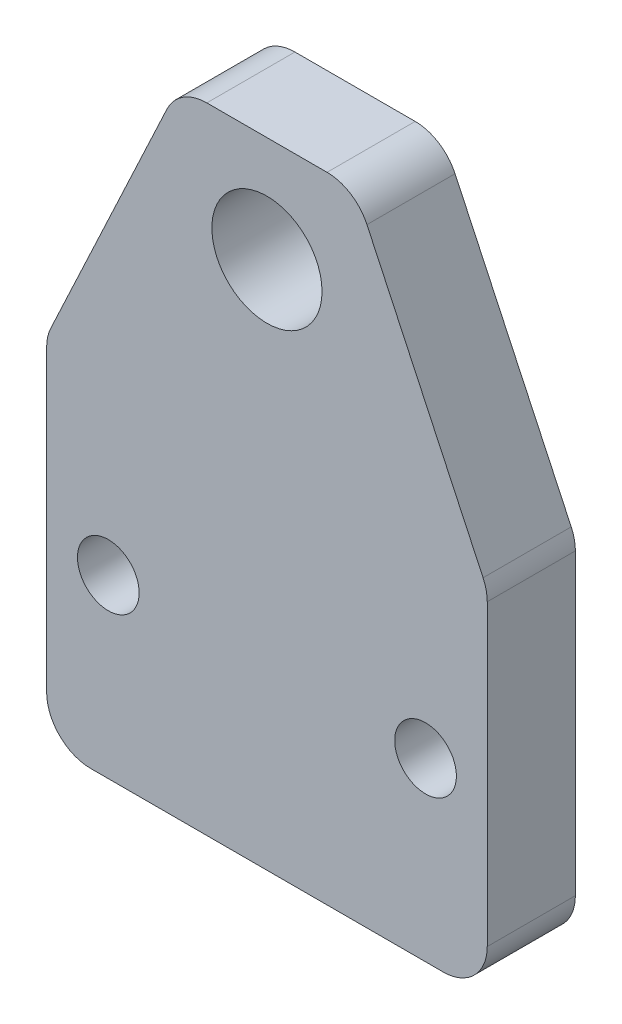
ISO-10303-21;
HEADER;
FILE_DESCRIPTION(('STEP AP214'),'2;1');
FILE_NAME('part.step','',(''),(''),'','','');
FILE_SCHEMA(('AUTOMOTIVE_DESIGN { 1 0 10303 214 1 1 1 1 }'));
ENDSEC;
DATA;
#1=APPLICATION_CONTEXT('core data for automotive mechanical design processes');
#2=APPLICATION_PROTOCOL_DEFINITION('international standard','automotive_design',2000,#1);
#3=PRODUCT_CONTEXT('',#1,'mechanical');
#4=PRODUCT('Part','Part','',(#3));
#5=PRODUCT_RELATED_PRODUCT_CATEGORY('part','',(#4));
#6=PRODUCT_DEFINITION_FORMATION('','',#4);
#7=PRODUCT_DEFINITION_CONTEXT('part definition',#1,'design');
#8=PRODUCT_DEFINITION('design','',#6,#7);
#9=PRODUCT_DEFINITION_SHAPE('','',#8);
#10=(LENGTH_UNIT() NAMED_UNIT(*) SI_UNIT(.MILLI.,.METRE.));
#11=(NAMED_UNIT(*) PLANE_ANGLE_UNIT() SI_UNIT($,.RADIAN.));
#12=(NAMED_UNIT(*) SI_UNIT($,.STERADIAN.) SOLID_ANGLE_UNIT());
#13=UNCERTAINTY_MEASURE_WITH_UNIT(LENGTH_MEASURE(1.E-05),#10,'distance_accuracy_value','');
#14=(GEOMETRIC_REPRESENTATION_CONTEXT(3) GLOBAL_UNCERTAINTY_ASSIGNED_CONTEXT((#13)) GLOBAL_UNIT_ASSIGNED_CONTEXT((#10,
#11,#12)) REPRESENTATION_CONTEXT('',''));
#15=CARTESIAN_POINT('',(0.,0.,0.));
#16=DIRECTION('',(0.,0.,1.));
#17=DIRECTION('',(1.,0.,0.));
#18=AXIS2_PLACEMENT_3D('',#15,#16,#17);
#19=CARTESIAN_POINT('',(25.,0.,10.));
#20=DIRECTION('',(-1.,0.,0.));
#21=DIRECTION('',(0.,-1.,0.));
#22=AXIS2_PLACEMENT_3D('',#19,#20,#21);
#23=PLANE('',#22);
#24=DIRECTION('',(0.,1.,0.));
#25=VECTOR('',#24,1.);
#26=CARTESIAN_POINT('',(25.,0.,10.));
#27=LINE('',#26,#25);
#28=CARTESIAN_POINT('',(25.,5.00000000000001,10.));
#29=VERTEX_POINT('',#28);
#30=CARTESIAN_POINT('',(25.,38.8862686352851,10.));
#31=VERTEX_POINT('',#30);
#32=EDGE_CURVE('E151',#29,#31,#27,.T.);
#33=ORIENTED_EDGE('',*,*,#32,.F.);
#34=DIRECTION('',(0.,0.,-1.));
#35=VECTOR('',#34,1.);
#36=CARTESIAN_POINT('',(25.,5.00000000000001,10.));
#37=LINE('',#36,#35);
#38=CARTESIAN_POINT('',(25.,5.00000000000001,0.));
#39=VERTEX_POINT('',#38);
#40=EDGE_CURVE('E186',#29,#39,#37,.T.);
#41=ORIENTED_EDGE('',*,*,#40,.T.);
#42=DIRECTION('',(0.,1.,0.));
#43=VECTOR('',#42,1.);
#44=CARTESIAN_POINT('',(25.,0.,0.));
#45=LINE('',#44,#43);
#46=CARTESIAN_POINT('',(25.,38.8862686352851,0.));
#47=VERTEX_POINT('',#46);
#48=EDGE_CURVE('E214',#39,#47,#45,.T.);
#49=ORIENTED_EDGE('',*,*,#48,.T.);
#50=DIRECTION('',(0.,0.,-1.));
#51=VECTOR('',#50,1.);
#52=CARTESIAN_POINT('',(25.,38.8862686352851,10.));
#53=LINE('',#52,#51);
#54=EDGE_CURVE('E184',#47,#31,#53,.F.);
#55=ORIENTED_EDGE('',*,*,#54,.T.);
#56=EDGE_LOOP('',(#33,#41,#49,#55));
#57=FACE_BOUND('',#56,.T.);
#58=ADVANCED_FACE('F35',(#57),#23,.F.);
#59=CARTESIAN_POINT('',(25.,40.,10.));
#60=DIRECTION('',(-0.905458935958868,-0.42443387623072,0.));
#61=DIRECTION('',(0.42443387623072,-0.905458935958868,0.));
#62=AXIS2_PLACEMENT_3D('',#59,#60,#61);
#63=PLANE('',#62);
#64=DIRECTION('',(-0.42443387623072,0.905458935958868,0.));
#65=VECTOR('',#64,1.);
#66=CARTESIAN_POINT('',(25.,40.,10.));
#67=LINE('',#66,#65);
#68=CARTESIAN_POINT('',(24.5272946797943,41.0084380164387,10.));
#69=VERTEX_POINT('',#68);
#70=CARTESIAN_POINT('',(11.3489831025843,69.1221693811536,10.));
#71=VERTEX_POINT('',#70);
#72=EDGE_CURVE('E155',#69,#71,#67,.T.);
#73=ORIENTED_EDGE('',*,*,#72,.F.);
#74=DIRECTION('',(0.,0.,-1.));
#75=VECTOR('',#74,1.);
#76=CARTESIAN_POINT('',(24.5272946797943,41.0084380164387,10.));
#77=LINE('',#76,#75);
#78=CARTESIAN_POINT('',(24.5272946797943,41.0084380164387,0.));
#79=VERTEX_POINT('',#78);
#80=EDGE_CURVE('E191',#69,#79,#77,.T.);
#81=ORIENTED_EDGE('',*,*,#80,.T.);
#82=DIRECTION('',(-0.42443387623072,0.905458935958868,0.));
#83=VECTOR('',#82,1.);
#84=CARTESIAN_POINT('',(25.,40.,0.));
#85=LINE('',#84,#83);
#86=CARTESIAN_POINT('',(11.3489831025843,69.1221693811536,0.));
#87=VERTEX_POINT('',#86);
#88=EDGE_CURVE('E212',#79,#87,#85,.T.);
#89=ORIENTED_EDGE('',*,*,#88,.T.);
#90=DIRECTION('',(0.,0.,-1.));
#91=VECTOR('',#90,1.);
#92=CARTESIAN_POINT('',(11.3489831025843,69.1221693811536,10.));
#93=LINE('',#92,#91);
#94=EDGE_CURVE('E189',#87,#71,#93,.F.);
#95=ORIENTED_EDGE('',*,*,#94,.T.);
#96=EDGE_LOOP('',(#73,#81,#89,#95));
#97=FACE_BOUND('',#96,.T.);
#98=ADVANCED_FACE('F276',(#97),#63,.F.);
#99=CARTESIAN_POINT('',(10.,72.,10.));
#100=DIRECTION('',(0.,-1.,0.));
#101=DIRECTION('',(0.,0.,-1.));
#102=AXIS2_PLACEMENT_3D('',#99,#100,#101);
#103=PLANE('',#102);
#104=DIRECTION('',(-1.,0.,0.));
#105=VECTOR('',#104,1.);
#106=CARTESIAN_POINT('',(10.,72.,10.));
#107=LINE('',#106,#105);
#108=CARTESIAN_POINT('',(6.82168842278991,72.,10.));
#109=VERTEX_POINT('',#108);
#110=CARTESIAN_POINT('',(-6.82168842278991,72.,10.));
#111=VERTEX_POINT('',#110);
#112=EDGE_CURVE('E206',#109,#111,#107,.T.);
#113=ORIENTED_EDGE('',*,*,#112,.F.);
#114=DIRECTION('',(0.,0.,-1.));
#115=VECTOR('',#114,1.);
#116=CARTESIAN_POINT('',(6.82168842278991,72.,10.));
#117=LINE('',#116,#115);
#118=CARTESIAN_POINT('',(6.82168842278991,72.,0.));
#119=VERTEX_POINT('',#118);
#120=EDGE_CURVE('E196',#109,#119,#117,.T.);
#121=ORIENTED_EDGE('',*,*,#120,.T.);
#122=DIRECTION('',(-1.,0.,0.));
#123=VECTOR('',#122,1.);
#124=CARTESIAN_POINT('',(10.,72.,0.));
#125=LINE('',#124,#123);
#126=CARTESIAN_POINT('',(-6.82168842278991,72.,0.));
#127=VERTEX_POINT('',#126);
#128=EDGE_CURVE('E204',#119,#127,#125,.T.);
#129=ORIENTED_EDGE('',*,*,#128,.T.);
#130=DIRECTION('',(0.,0.,-1.));
#131=VECTOR('',#130,1.);
#132=CARTESIAN_POINT('',(-6.82168842278991,72.,10.));
#133=LINE('',#132,#131);
#134=EDGE_CURVE('E194',#127,#111,#133,.F.);
#135=ORIENTED_EDGE('',*,*,#134,.T.);
#136=EDGE_LOOP('',(#113,#121,#129,#135));
#137=FACE_BOUND('',#136,.T.);
#138=ADVANCED_FACE('F203',(#137),#103,.F.);
#139=CARTESIAN_POINT('',(-25.,40.,10.));
#140=DIRECTION('',(0.905458935958869,-0.42443387623072,0.));
#141=DIRECTION('',(0.42443387623072,0.905458935958869,0.));
#142=AXIS2_PLACEMENT_3D('',#139,#140,#141);
#143=PLANE('',#142);
#144=DIRECTION('',(-0.42443387623072,-0.905458935958869,0.));
#145=VECTOR('',#144,1.);
#146=CARTESIAN_POINT('',(-25.,40.,10.));
#147=LINE('',#146,#145);
#148=CARTESIAN_POINT('',(-11.3489831025843,69.1221693811536,10.));
#149=VERTEX_POINT('',#148);
#150=CARTESIAN_POINT('',(-24.5272946797943,41.0084380164387,10.));
#151=VERTEX_POINT('',#150);
#152=EDGE_CURVE('E224',#149,#151,#147,.T.);
#153=ORIENTED_EDGE('',*,*,#152,.F.);
#154=DIRECTION('',(0.,0.,-1.));
#155=VECTOR('',#154,1.);
#156=CARTESIAN_POINT('',(-11.3489831025843,69.1221693811536,10.));
#157=LINE('',#156,#155);
#158=CARTESIAN_POINT('',(-11.3489831025843,69.1221693811536,0.));
#159=VERTEX_POINT('',#158);
#160=EDGE_CURVE('E11',#149,#159,#157,.T.);
#161=ORIENTED_EDGE('',*,*,#160,.T.);
#162=DIRECTION('',(-0.42443387623072,-0.905458935958869,0.));
#163=VECTOR('',#162,1.);
#164=CARTESIAN_POINT('',(-25.,40.,0.));
#165=LINE('',#164,#163);
#166=CARTESIAN_POINT('',(-24.5272946797943,41.0084380164387,0.));
#167=VERTEX_POINT('',#166);
#168=EDGE_CURVE('E157',#159,#167,#165,.T.);
#169=ORIENTED_EDGE('',*,*,#168,.T.);
#170=DIRECTION('',(0.,0.,-1.));
#171=VECTOR('',#170,1.);
#172=CARTESIAN_POINT('',(-24.5272946797943,41.0084380164387,10.));
#173=LINE('',#172,#171);
#174=EDGE_CURVE('E43',#167,#151,#173,.F.);
#175=ORIENTED_EDGE('',*,*,#174,.T.);
#176=EDGE_LOOP('',(#153,#161,#169,#175));
#177=FACE_BOUND('',#176,.T.);
#178=ADVANCED_FACE('F268',(#177),#143,.F.);
#179=CARTESIAN_POINT('',(-25.,0.,10.));
#180=DIRECTION('',(1.,0.,0.));
#181=DIRECTION('',(0.,1.,0.));
#182=AXIS2_PLACEMENT_3D('',#179,#180,#181);
#183=PLANE('',#182);
#184=DIRECTION('',(0.,-1.,0.));
#185=VECTOR('',#184,1.);
#186=CARTESIAN_POINT('',(-25.,0.,0.));
#187=LINE('',#186,#185);
#188=CARTESIAN_POINT('',(-25.,38.8862686352851,0.));
#189=VERTEX_POINT('',#188);
#190=CARTESIAN_POINT('',(-25.,5.,0.));
#191=VERTEX_POINT('',#190);
#192=EDGE_CURVE('E152',#189,#191,#187,.T.);
#193=ORIENTED_EDGE('',*,*,#192,.T.);
#194=DIRECTION('',(0.,0.,-1.));
#195=VECTOR('',#194,1.);
#196=CARTESIAN_POINT('',(-25.,5.,10.));
#197=LINE('',#196,#195);
#198=CARTESIAN_POINT('',(-25.,5.,10.));
#199=VERTEX_POINT('',#198);
#200=EDGE_CURVE('E130',#191,#199,#197,.F.);
#201=ORIENTED_EDGE('',*,*,#200,.T.);
#202=DIRECTION('',(0.,-1.,0.));
#203=VECTOR('',#202,1.);
#204=CARTESIAN_POINT('',(-25.,0.,10.));
#205=LINE('',#204,#203);
#206=CARTESIAN_POINT('',(-25.,38.8862686352851,10.));
#207=VERTEX_POINT('',#206);
#208=EDGE_CURVE('E221',#207,#199,#205,.T.);
#209=ORIENTED_EDGE('',*,*,#208,.F.);
#210=DIRECTION('',(0.,0.,-1.));
#211=VECTOR('',#210,1.);
#212=CARTESIAN_POINT('',(-25.,38.8862686352851,10.));
#213=LINE('',#212,#211);
#214=EDGE_CURVE('E135',#207,#189,#213,.T.);
#215=ORIENTED_EDGE('',*,*,#214,.T.);
#216=EDGE_LOOP('',(#193,#201,#209,#215));
#217=FACE_BOUND('',#216,.T.);
#218=ADVANCED_FACE('F266',(#217),#183,.F.);
#219=CARTESIAN_POINT('',(-25.,0.,10.));
#220=DIRECTION('',(0.,1.,0.));
#221=DIRECTION('',(-1.,0.,0.));
#222=AXIS2_PLACEMENT_3D('',#219,#220,#221);
#223=PLANE('',#222);
#224=DIRECTION('',(1.,0.,0.));
#225=VECTOR('',#224,1.);
#226=CARTESIAN_POINT('',(-25.,0.,10.));
#227=LINE('',#226,#225);
#228=CARTESIAN_POINT('',(-20.,0.,10.));
#229=VERTEX_POINT('',#228);
#230=CARTESIAN_POINT('',(20.,0.,10.));
#231=VERTEX_POINT('',#230);
#232=EDGE_CURVE('E145',#229,#231,#227,.T.);
#233=ORIENTED_EDGE('',*,*,#232,.F.);
#234=DIRECTION('',(0.,0.,-1.));
#235=VECTOR('',#234,1.);
#236=CARTESIAN_POINT('',(-20.,0.,10.));
#237=LINE('',#236,#235);
#238=CARTESIAN_POINT('',(-20.,0.,0.));
#239=VERTEX_POINT('',#238);
#240=EDGE_CURVE('E129',#229,#239,#237,.T.);
#241=ORIENTED_EDGE('',*,*,#240,.T.);
#242=DIRECTION('',(1.,0.,0.));
#243=VECTOR('',#242,1.);
#244=CARTESIAN_POINT('',(-25.,0.,0.));
#245=LINE('',#244,#243);
#246=CARTESIAN_POINT('',(20.,0.,0.));
#247=VERTEX_POINT('',#246);
#248=EDGE_CURVE('E142',#239,#247,#245,.T.);
#249=ORIENTED_EDGE('',*,*,#248,.T.);
#250=DIRECTION('',(0.,0.,-1.));
#251=VECTOR('',#250,1.);
#252=CARTESIAN_POINT('',(20.,0.,10.));
#253=LINE('',#252,#251);
#254=EDGE_CURVE('E147',#247,#231,#253,.F.);
#255=ORIENTED_EDGE('',*,*,#254,.T.);
#256=EDGE_LOOP('',(#233,#241,#249,#255));
#257=FACE_BOUND('',#256,.T.);
#258=ADVANCED_FACE('F141',(#257),#223,.F.);
#259=CARTESIAN_POINT('',(0.,0.,10.));
#260=DIRECTION('',(0.,0.,1.));
#261=DIRECTION('',(1.,0.,0.));
#262=AXIS2_PLACEMENT_3D('',#259,#260,#261);
#263=PLANE('',#262);
#264=CARTESIAN_POINT('',(0.,60.,10.));
#265=DIRECTION('',(0.,0.,1.));
#266=DIRECTION('',(1.,0.,0.));
#267=AXIS2_PLACEMENT_3D('',#264,#265,#266);
#268=CIRCLE('',#267,6.25);
#269=CARTESIAN_POINT('',(6.25,60.,10.));
#270=VERTEX_POINT('',#269);
#271=EDGE_CURVE('E241',#270,#270,#268,.T.);
#272=ORIENTED_EDGE('',*,*,#271,.F.);
#273=EDGE_LOOP('',(#272));
#274=FACE_BOUND('',#273,.T.);
#275=CARTESIAN_POINT('',(-18.,20.,10.));
#276=DIRECTION('',(0.,0.,1.));
#277=DIRECTION('',(1.,0.,0.));
#278=AXIS2_PLACEMENT_3D('',#275,#276,#277);
#279=CIRCLE('',#278,3.5);
#280=CARTESIAN_POINT('',(-14.5,20.,10.));
#281=VERTEX_POINT('',#280);
#282=EDGE_CURVE('E234',#281,#281,#279,.T.);
#283=ORIENTED_EDGE('',*,*,#282,.F.);
#284=EDGE_LOOP('',(#283));
#285=FACE_BOUND('',#284,.T.);
#286=CARTESIAN_POINT('',(18.,20.,10.));
#287=DIRECTION('',(0.,0.,1.));
#288=DIRECTION('',(1.,0.,0.));
#289=AXIS2_PLACEMENT_3D('',#286,#287,#288);
#290=CIRCLE('',#289,3.5);
#291=CARTESIAN_POINT('',(21.5,20.,10.));
#292=VERTEX_POINT('',#291);
#293=EDGE_CURVE('E219',#292,#292,#290,.T.);
#294=ORIENTED_EDGE('',*,*,#293,.F.);
#295=EDGE_LOOP('',(#294));
#296=FACE_BOUND('',#295,.T.);
#297=ORIENTED_EDGE('',*,*,#208,.T.);
#298=CARTESIAN_POINT('',(-20.,5.,10.));
#299=DIRECTION('',(0.,0.,1.));
#300=DIRECTION('',(1.,0.,0.));
#301=AXIS2_PLACEMENT_3D('',#298,#299,#300);
#302=CIRCLE('',#301,5.);
#303=EDGE_CURVE('E182',#199,#229,#302,.T.);
#304=ORIENTED_EDGE('',*,*,#303,.T.);
#305=ORIENTED_EDGE('',*,*,#232,.T.);
#306=CARTESIAN_POINT('',(20.,5.00000000000001,10.));
#307=DIRECTION('',(0.,0.,1.));
#308=DIRECTION('',(1.,0.,0.));
#309=AXIS2_PLACEMENT_3D('',#306,#307,#308);
#310=CIRCLE('',#309,5.);
#311=EDGE_CURVE('E180',#231,#29,#310,.T.);
#312=ORIENTED_EDGE('',*,*,#311,.T.);
#313=ORIENTED_EDGE('',*,*,#32,.T.);
#314=CARTESIAN_POINT('',(20.,38.8862686352851,10.));
#315=DIRECTION('',(0.,0.,1.));
#316=DIRECTION('',(1.,0.,0.));
#317=AXIS2_PLACEMENT_3D('',#314,#315,#316);
#318=CIRCLE('',#317,5.);
#319=EDGE_CURVE('E178',#31,#69,#318,.T.);
#320=ORIENTED_EDGE('',*,*,#319,.T.);
#321=ORIENTED_EDGE('',*,*,#72,.T.);
#322=CARTESIAN_POINT('',(6.82168842278991,67.,10.));
#323=DIRECTION('',(0.,0.,1.));
#324=DIRECTION('',(1.,0.,0.));
#325=AXIS2_PLACEMENT_3D('',#322,#323,#324);
#326=CIRCLE('',#325,5.);
#327=EDGE_CURVE('E176',#71,#109,#326,.T.);
#328=ORIENTED_EDGE('',*,*,#327,.T.);
#329=ORIENTED_EDGE('',*,*,#112,.T.);
#330=CARTESIAN_POINT('',(-6.82168842278991,67.,10.));
#331=DIRECTION('',(0.,0.,1.));
#332=DIRECTION('',(1.,0.,0.));
#333=AXIS2_PLACEMENT_3D('',#330,#331,#332);
#334=CIRCLE('',#333,5.);
#335=EDGE_CURVE('E56',#111,#149,#334,.T.);
#336=ORIENTED_EDGE('',*,*,#335,.T.);
#337=ORIENTED_EDGE('',*,*,#152,.T.);
#338=CARTESIAN_POINT('',(-20.,38.8862686352851,10.));
#339=DIRECTION('',(0.,0.,1.));
#340=DIRECTION('',(1.,0.,0.));
#341=AXIS2_PLACEMENT_3D('',#338,#339,#340);
#342=CIRCLE('',#341,5.);
#343=EDGE_CURVE('E173',#151,#207,#342,.T.);
#344=ORIENTED_EDGE('',*,*,#343,.T.);
#345=EDGE_LOOP('',(#297,#304,#305,#312,#313,#320,#321,#328,#329,#336,#337,#344));
#346=FACE_BOUND('',#345,.T.);
#347=ADVANCED_FACE('F255',(#274,#285,#296,#346),#263,.T.);
#348=CARTESIAN_POINT('',(0.,0.,0.));
#349=DIRECTION('',(0.,0.,1.));
#350=DIRECTION('',(1.,0.,0.));
#351=AXIS2_PLACEMENT_3D('',#348,#349,#350);
#352=PLANE('',#351);
#353=CARTESIAN_POINT('',(0.,60.,0.));
#354=DIRECTION('',(0.,0.,1.));
#355=DIRECTION('',(1.,0.,0.));
#356=AXIS2_PLACEMENT_3D('',#353,#354,#355);
#357=CIRCLE('',#356,6.25);
#358=CARTESIAN_POINT('',(6.25,60.,0.));
#359=VERTEX_POINT('',#358);
#360=EDGE_CURVE('E240',#359,#359,#357,.T.);
#361=ORIENTED_EDGE('',*,*,#360,.T.);
#362=EDGE_LOOP('',(#361));
#363=FACE_BOUND('',#362,.T.);
#364=CARTESIAN_POINT('',(-18.,20.,0.));
#365=DIRECTION('',(0.,0.,1.));
#366=DIRECTION('',(-1.,0.,0.));
#367=AXIS2_PLACEMENT_3D('',#364,#365,#366);
#368=CIRCLE('',#367,3.5);
#369=CARTESIAN_POINT('',(-21.5,20.,0.));
#370=VERTEX_POINT('',#369);
#371=EDGE_CURVE('E237',#370,#370,#368,.T.);
#372=ORIENTED_EDGE('',*,*,#371,.T.);
#373=EDGE_LOOP('',(#372));
#374=FACE_BOUND('',#373,.T.);
#375=CARTESIAN_POINT('',(18.,20.,0.));
#376=DIRECTION('',(0.,0.,1.));
#377=DIRECTION('',(1.,0.,0.));
#378=AXIS2_PLACEMENT_3D('',#375,#376,#377);
#379=CIRCLE('',#378,3.5);
#380=CARTESIAN_POINT('',(21.5,20.,0.));
#381=VERTEX_POINT('',#380);
#382=EDGE_CURVE('E231',#381,#381,#379,.T.);
#383=ORIENTED_EDGE('',*,*,#382,.T.);
#384=EDGE_LOOP('',(#383));
#385=FACE_BOUND('',#384,.T.);
#386=ORIENTED_EDGE('',*,*,#248,.F.);
#387=CARTESIAN_POINT('',(-20.,5.,0.));
#388=DIRECTION('',(0.,0.,1.));
#389=DIRECTION('',(1.,0.,0.));
#390=AXIS2_PLACEMENT_3D('',#387,#388,#389);
#391=CIRCLE('',#390,5.);
#392=EDGE_CURVE('E125',#239,#191,#391,.F.);
#393=ORIENTED_EDGE('',*,*,#392,.T.);
#394=ORIENTED_EDGE('',*,*,#192,.F.);
#395=CARTESIAN_POINT('',(-20.,38.8862686352851,0.));
#396=DIRECTION('',(0.,0.,1.));
#397=DIRECTION('',(1.,0.,0.));
#398=AXIS2_PLACEMENT_3D('',#395,#396,#397);
#399=CIRCLE('',#398,5.);
#400=EDGE_CURVE('E146',#189,#167,#399,.F.);
#401=ORIENTED_EDGE('',*,*,#400,.T.);
#402=ORIENTED_EDGE('',*,*,#168,.F.);
#403=CARTESIAN_POINT('',(-6.82168842278991,67.,0.));
#404=DIRECTION('',(0.,0.,1.));
#405=DIRECTION('',(1.,0.,0.));
#406=AXIS2_PLACEMENT_3D('',#403,#404,#405);
#407=CIRCLE('',#406,5.);
#408=EDGE_CURVE('E163',#159,#127,#407,.F.);
#409=ORIENTED_EDGE('',*,*,#408,.T.);
#410=ORIENTED_EDGE('',*,*,#128,.F.);
#411=CARTESIAN_POINT('',(6.82168842278991,67.,0.));
#412=DIRECTION('',(0.,0.,1.));
#413=DIRECTION('',(1.,0.,0.));
#414=AXIS2_PLACEMENT_3D('',#411,#412,#413);
#415=CIRCLE('',#414,5.);
#416=EDGE_CURVE('E165',#119,#87,#415,.F.);
#417=ORIENTED_EDGE('',*,*,#416,.T.);
#418=ORIENTED_EDGE('',*,*,#88,.F.);
#419=CARTESIAN_POINT('',(20.,38.8862686352851,0.));
#420=DIRECTION('',(0.,0.,1.));
#421=DIRECTION('',(1.,0.,0.));
#422=AXIS2_PLACEMENT_3D('',#419,#420,#421);
#423=CIRCLE('',#422,5.);
#424=EDGE_CURVE('E167',#79,#47,#423,.F.);
#425=ORIENTED_EDGE('',*,*,#424,.T.);
#426=ORIENTED_EDGE('',*,*,#48,.F.);
#427=CARTESIAN_POINT('',(20.,5.00000000000001,0.));
#428=DIRECTION('',(0.,0.,1.));
#429=DIRECTION('',(1.,0.,0.));
#430=AXIS2_PLACEMENT_3D('',#427,#428,#429);
#431=CIRCLE('',#430,5.);
#432=EDGE_CURVE('E136',#39,#247,#431,.F.);
#433=ORIENTED_EDGE('',*,*,#432,.T.);
#434=EDGE_LOOP('',(#386,#393,#394,#401,#402,#409,#410,#417,#418,#425,#426,#433));
#435=FACE_BOUND('',#434,.T.);
#436=ADVANCED_FACE('F149',(#363,#374,#385,#435),#352,.F.);
#437=CARTESIAN_POINT('',(18.,20.,0.));
#438=DIRECTION('',(0.,0.,1.));
#439=DIRECTION('',(1.,0.,0.));
#440=AXIS2_PLACEMENT_3D('',#437,#438,#439);
#441=CYLINDRICAL_SURFACE('',#440,3.5);
#442=ORIENTED_EDGE('',*,*,#293,.T.);
#443=EDGE_LOOP('',(#442));
#444=FACE_BOUND('',#443,.T.);
#445=ORIENTED_EDGE('',*,*,#382,.F.);
#446=EDGE_LOOP('',(#445));
#447=FACE_BOUND('',#446,.T.);
#448=ADVANCED_FACE('F313',(#444,#447),#441,.F.);
#449=CARTESIAN_POINT('',(-18.,20.,0.));
#450=DIRECTION('',(0.,0.,1.));
#451=DIRECTION('',(1.,0.,0.));
#452=AXIS2_PLACEMENT_3D('',#449,#450,#451);
#453=CYLINDRICAL_SURFACE('',#452,3.5);
#454=ORIENTED_EDGE('',*,*,#282,.T.);
#455=EDGE_LOOP('',(#454));
#456=FACE_BOUND('',#455,.T.);
#457=ORIENTED_EDGE('',*,*,#371,.F.);
#458=EDGE_LOOP('',(#457));
#459=FACE_BOUND('',#458,.T.);
#460=ADVANCED_FACE('F295',(#456,#459),#453,.F.);
#461=CARTESIAN_POINT('',(-20.,5.,10.));
#462=DIRECTION('',(0.,0.,-1.));
#463=DIRECTION('',(-1.,0.,0.));
#464=AXIS2_PLACEMENT_3D('',#461,#462,#463);
#465=CYLINDRICAL_SURFACE('',#464,5.);
#466=ORIENTED_EDGE('',*,*,#303,.F.);
#467=ORIENTED_EDGE('',*,*,#200,.F.);
#468=ORIENTED_EDGE('',*,*,#392,.F.);
#469=ORIENTED_EDGE('',*,*,#240,.F.);
#470=EDGE_LOOP('',(#466,#467,#468,#469));
#471=FACE_BOUND('',#470,.T.);
#472=ADVANCED_FACE('F128',(#471),#465,.T.);
#473=CARTESIAN_POINT('',(20.,5.00000000000001,10.));
#474=DIRECTION('',(0.,0.,-1.));
#475=DIRECTION('',(-1.,0.,0.));
#476=AXIS2_PLACEMENT_3D('',#473,#474,#475);
#477=CYLINDRICAL_SURFACE('',#476,5.);
#478=ORIENTED_EDGE('',*,*,#311,.F.);
#479=ORIENTED_EDGE('',*,*,#254,.F.);
#480=ORIENTED_EDGE('',*,*,#432,.F.);
#481=ORIENTED_EDGE('',*,*,#40,.F.);
#482=EDGE_LOOP('',(#478,#479,#480,#481));
#483=FACE_BOUND('',#482,.T.);
#484=ADVANCED_FACE('F287',(#483),#477,.T.);
#485=CARTESIAN_POINT('',(20.,38.8862686352851,10.));
#486=DIRECTION('',(0.,0.,-1.));
#487=DIRECTION('',(-1.,0.,0.));
#488=AXIS2_PLACEMENT_3D('',#485,#486,#487);
#489=CYLINDRICAL_SURFACE('',#488,5.);
#490=ORIENTED_EDGE('',*,*,#319,.F.);
#491=ORIENTED_EDGE('',*,*,#54,.F.);
#492=ORIENTED_EDGE('',*,*,#424,.F.);
#493=ORIENTED_EDGE('',*,*,#80,.F.);
#494=EDGE_LOOP('',(#490,#491,#492,#493));
#495=FACE_BOUND('',#494,.T.);
#496=ADVANCED_FACE('F284',(#495),#489,.T.);
#497=CARTESIAN_POINT('',(6.82168842278991,67.,10.));
#498=DIRECTION('',(0.,0.,-1.));
#499=DIRECTION('',(-1.,0.,0.));
#500=AXIS2_PLACEMENT_3D('',#497,#498,#499);
#501=CYLINDRICAL_SURFACE('',#500,5.);
#502=ORIENTED_EDGE('',*,*,#327,.F.);
#503=ORIENTED_EDGE('',*,*,#94,.F.);
#504=ORIENTED_EDGE('',*,*,#416,.F.);
#505=ORIENTED_EDGE('',*,*,#120,.F.);
#506=EDGE_LOOP('',(#502,#503,#504,#505));
#507=FACE_BOUND('',#506,.T.);
#508=ADVANCED_FACE('F274',(#507),#501,.T.);
#509=CARTESIAN_POINT('',(-6.82168842278991,67.,10.));
#510=DIRECTION('',(0.,0.,-1.));
#511=DIRECTION('',(-1.,0.,0.));
#512=AXIS2_PLACEMENT_3D('',#509,#510,#511);
#513=CYLINDRICAL_SURFACE('',#512,5.);
#514=ORIENTED_EDGE('',*,*,#335,.F.);
#515=ORIENTED_EDGE('',*,*,#134,.F.);
#516=ORIENTED_EDGE('',*,*,#408,.F.);
#517=ORIENTED_EDGE('',*,*,#160,.F.);
#518=EDGE_LOOP('',(#514,#515,#516,#517));
#519=FACE_BOUND('',#518,.T.);
#520=ADVANCED_FACE('F271',(#519),#513,.T.);
#521=CARTESIAN_POINT('',(-20.,38.8862686352851,10.));
#522=DIRECTION('',(0.,0.,-1.));
#523=DIRECTION('',(-1.,0.,0.));
#524=AXIS2_PLACEMENT_3D('',#521,#522,#523);
#525=CYLINDRICAL_SURFACE('',#524,5.);
#526=ORIENTED_EDGE('',*,*,#343,.F.);
#527=ORIENTED_EDGE('',*,*,#174,.F.);
#528=ORIENTED_EDGE('',*,*,#400,.F.);
#529=ORIENTED_EDGE('',*,*,#214,.F.);
#530=EDGE_LOOP('',(#526,#527,#528,#529));
#531=FACE_BOUND('',#530,.T.);
#532=ADVANCED_FACE('F37',(#531),#525,.T.);
#533=CARTESIAN_POINT('',(0.,60.,0.));
#534=DIRECTION('',(0.,0.,1.));
#535=DIRECTION('',(1.,0.,0.));
#536=AXIS2_PLACEMENT_3D('',#533,#534,#535);
#537=CYLINDRICAL_SURFACE('',#536,6.25);
#538=ORIENTED_EDGE('',*,*,#360,.F.);
#539=EDGE_LOOP('',(#538));
#540=FACE_BOUND('',#539,.T.);
#541=ORIENTED_EDGE('',*,*,#271,.T.);
#542=EDGE_LOOP('',(#541));
#543=FACE_BOUND('',#542,.T.);
#544=ADVANCED_FACE('F249',(#540,#543),#537,.F.);
#545=CLOSED_SHELL('',(#58,#98,#138,#178,#218,#258,#347,#436,#448,#460,#472,#484,#496,#508,#520,
#532,#544));
#546=MANIFOLD_SOLID_BREP('B2',#545);
#547=ADVANCED_BREP_SHAPE_REPRESENTATION('',(#18,#546),#14);
#548=SHAPE_DEFINITION_REPRESENTATION(#9,#547);
ENDSEC;
END-ISO-10303-21;
